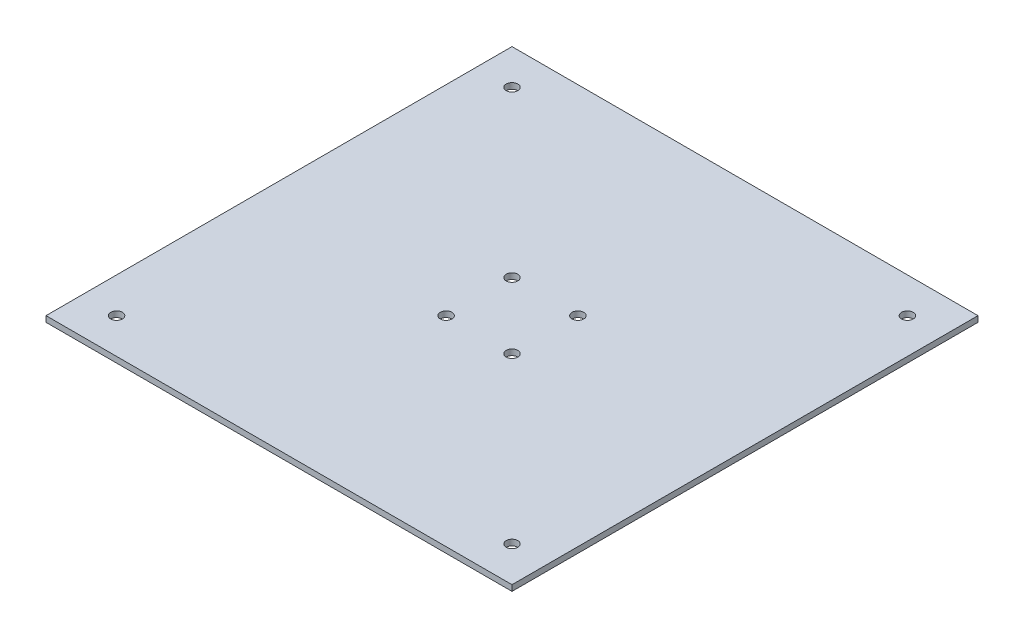
ISO-10303-21;
HEADER;
FILE_DESCRIPTION(('STEP AP214'),'2;1');
FILE_NAME('part.step','',(''),(''),'','','');
FILE_SCHEMA(('AUTOMOTIVE_DESIGN { 1 0 10303 214 1 1 1 1 }'));
ENDSEC;
DATA;
#1=APPLICATION_CONTEXT('core data for automotive mechanical design processes');
#2=APPLICATION_PROTOCOL_DEFINITION('international standard','automotive_design',2000,#1);
#3=PRODUCT_CONTEXT('',#1,'mechanical');
#4=PRODUCT('Part','Part','',(#3));
#5=PRODUCT_RELATED_PRODUCT_CATEGORY('part','',(#4));
#6=PRODUCT_DEFINITION_FORMATION('','',#4);
#7=PRODUCT_DEFINITION_CONTEXT('part definition',#1,'design');
#8=PRODUCT_DEFINITION('design','',#6,#7);
#9=PRODUCT_DEFINITION_SHAPE('','',#8);
#10=(LENGTH_UNIT() NAMED_UNIT(*) SI_UNIT(.MILLI.,.METRE.));
#11=(NAMED_UNIT(*) PLANE_ANGLE_UNIT() SI_UNIT($,.RADIAN.));
#12=(NAMED_UNIT(*) SI_UNIT($,.STERADIAN.) SOLID_ANGLE_UNIT());
#13=UNCERTAINTY_MEASURE_WITH_UNIT(LENGTH_MEASURE(1.E-05),#10,'distance_accuracy_value','');
#14=(GEOMETRIC_REPRESENTATION_CONTEXT(3) GLOBAL_UNCERTAINTY_ASSIGNED_CONTEXT((#13)) GLOBAL_UNIT_ASSIGNED_CONTEXT((#10,
#11,#12)) REPRESENTATION_CONTEXT('',''));
#15=CARTESIAN_POINT('',(0.,0.,0.));
#16=DIRECTION('',(0.,0.,1.));
#17=DIRECTION('',(1.,0.,0.));
#18=AXIS2_PLACEMENT_3D('',#15,#16,#17);
#19=CARTESIAN_POINT('',(0.,1.5875,0.));
#20=DIRECTION('',(1.,0.,0.));
#21=DIRECTION('',(0.,0.,-1.));
#22=AXIS2_PLACEMENT_3D('',#19,#20,#21);
#23=PLANE('',#22);
#24=DIRECTION('',(0.,0.,1.));
#25=VECTOR('',#24,1.);
#26=CARTESIAN_POINT('',(0.,0.,0.));
#27=LINE('',#26,#25);
#28=CARTESIAN_POINT('',(0.,0.,-127.));
#29=VERTEX_POINT('',#28);
#30=CARTESIAN_POINT('',(0.,0.,0.));
#31=VERTEX_POINT('',#30);
#32=EDGE_CURVE('E98',#29,#31,#27,.T.);
#33=ORIENTED_EDGE('',*,*,#32,.T.);
#34=DIRECTION('',(0.,-1.,0.));
#35=VECTOR('',#34,1.);
#36=CARTESIAN_POINT('',(0.,1.5875,0.));
#37=LINE('',#36,#35);
#38=CARTESIAN_POINT('',(0.,1.5875,0.));
#39=VERTEX_POINT('',#38);
#40=EDGE_CURVE('E11',#39,#31,#37,.T.);
#41=ORIENTED_EDGE('',*,*,#40,.F.);
#42=DIRECTION('',(0.,0.,1.));
#43=VECTOR('',#42,1.);
#44=CARTESIAN_POINT('',(0.,1.5875,0.));
#45=LINE('',#44,#43);
#46=CARTESIAN_POINT('',(0.,1.5875,-127.));
#47=VERTEX_POINT('',#46);
#48=EDGE_CURVE('E86',#47,#39,#45,.T.);
#49=ORIENTED_EDGE('',*,*,#48,.F.);
#50=DIRECTION('',(0.,-1.,0.));
#51=VECTOR('',#50,1.);
#52=CARTESIAN_POINT('',(0.,1.5875,-127.));
#53=LINE('',#52,#51);
#54=EDGE_CURVE('E94',#47,#29,#53,.T.);
#55=ORIENTED_EDGE('',*,*,#54,.T.);
#56=EDGE_LOOP('',(#33,#41,#49,#55));
#57=FACE_BOUND('',#56,.T.);
#58=ADVANCED_FACE('F35',(#57),#23,.F.);
#59=CARTESIAN_POINT('',(0.,1.5875,0.));
#60=DIRECTION('',(0.,0.,-1.));
#61=DIRECTION('',(-1.,0.,0.));
#62=AXIS2_PLACEMENT_3D('',#59,#60,#61);
#63=PLANE('',#62);
#64=DIRECTION('',(1.,0.,0.));
#65=VECTOR('',#64,1.);
#66=CARTESIAN_POINT('',(0.,0.,0.));
#67=LINE('',#66,#65);
#68=CARTESIAN_POINT('',(127.,0.,0.));
#69=VERTEX_POINT('',#68);
#70=EDGE_CURVE('E90',#31,#69,#67,.T.);
#71=ORIENTED_EDGE('',*,*,#70,.T.);
#72=DIRECTION('',(0.,-1.,0.));
#73=VECTOR('',#72,1.);
#74=CARTESIAN_POINT('',(127.,1.5875,0.));
#75=LINE('',#74,#73);
#76=CARTESIAN_POINT('',(127.,1.5875,0.));
#77=VERTEX_POINT('',#76);
#78=EDGE_CURVE('E43',#77,#69,#75,.T.);
#79=ORIENTED_EDGE('',*,*,#78,.F.);
#80=DIRECTION('',(1.,0.,0.));
#81=VECTOR('',#80,1.);
#82=CARTESIAN_POINT('',(0.,1.5875,0.));
#83=LINE('',#82,#81);
#84=EDGE_CURVE('E81',#39,#77,#83,.T.);
#85=ORIENTED_EDGE('',*,*,#84,.F.);
#86=ORIENTED_EDGE('',*,*,#40,.T.);
#87=EDGE_LOOP('',(#71,#79,#85,#86));
#88=FACE_BOUND('',#87,.T.);
#89=ADVANCED_FACE('F89',(#88),#63,.F.);
#90=CARTESIAN_POINT('',(127.,1.5875,0.));
#91=DIRECTION('',(-1.,0.,0.));
#92=DIRECTION('',(0.,0.,1.));
#93=AXIS2_PLACEMENT_3D('',#90,#91,#92);
#94=PLANE('',#93);
#95=DIRECTION('',(0.,0.,-1.));
#96=VECTOR('',#95,1.);
#97=CARTESIAN_POINT('',(127.,0.,0.));
#98=LINE('',#97,#96);
#99=CARTESIAN_POINT('',(127.,0.,-127.));
#100=VERTEX_POINT('',#99);
#101=EDGE_CURVE('E68',#69,#100,#98,.T.);
#102=ORIENTED_EDGE('',*,*,#101,.T.);
#103=DIRECTION('',(0.,-1.,0.));
#104=VECTOR('',#103,1.);
#105=CARTESIAN_POINT('',(127.,1.5875,-127.));
#106=LINE('',#105,#104);
#107=CARTESIAN_POINT('',(127.,1.5875,-127.));
#108=VERTEX_POINT('',#107);
#109=EDGE_CURVE('E91',#108,#100,#106,.T.);
#110=ORIENTED_EDGE('',*,*,#109,.F.);
#111=DIRECTION('',(0.,0.,-1.));
#112=VECTOR('',#111,1.);
#113=CARTESIAN_POINT('',(127.,1.5875,0.));
#114=LINE('',#113,#112);
#115=EDGE_CURVE('E84',#77,#108,#114,.T.);
#116=ORIENTED_EDGE('',*,*,#115,.F.);
#117=ORIENTED_EDGE('',*,*,#78,.T.);
#118=EDGE_LOOP('',(#102,#110,#116,#117));
#119=FACE_BOUND('',#118,.T.);
#120=ADVANCED_FACE('F92',(#119),#94,.F.);
#121=CARTESIAN_POINT('',(0.,1.5875,-127.));
#122=DIRECTION('',(0.,0.,1.));
#123=DIRECTION('',(1.,0.,0.));
#124=AXIS2_PLACEMENT_3D('',#121,#122,#123);
#125=PLANE('',#124);
#126=DIRECTION('',(-1.,0.,0.));
#127=VECTOR('',#126,1.);
#128=CARTESIAN_POINT('',(0.,0.,-127.));
#129=LINE('',#128,#127);
#130=EDGE_CURVE('E74',#100,#29,#129,.T.);
#131=ORIENTED_EDGE('',*,*,#130,.T.);
#132=ORIENTED_EDGE('',*,*,#54,.F.);
#133=DIRECTION('',(-1.,0.,0.));
#134=VECTOR('',#133,1.);
#135=CARTESIAN_POINT('',(0.,1.5875,-127.));
#136=LINE('',#135,#134);
#137=EDGE_CURVE('E51',#108,#47,#136,.T.);
#138=ORIENTED_EDGE('',*,*,#137,.F.);
#139=ORIENTED_EDGE('',*,*,#109,.T.);
#140=EDGE_LOOP('',(#131,#132,#138,#139));
#141=FACE_BOUND('',#140,.T.);
#142=ADVANCED_FACE('F106',(#141),#125,.F.);
#143=CARTESIAN_POINT('',(0.,1.5875,-127.));
#144=DIRECTION('',(0.,-1.,0.));
#145=DIRECTION('',(0.,0.,-1.));
#146=AXIS2_PLACEMENT_3D('',#143,#144,#145);
#147=PLANE('',#146);
#148=CARTESIAN_POINT('',(117.381536726415,1.5875,-117.381536726415));
#149=DIRECTION('',(0.,1.,0.));
#150=DIRECTION('',(1.,0.,0.));
#151=AXIS2_PLACEMENT_3D('',#148,#149,#150);
#152=CIRCLE('',#151,1.5875);
#153=CARTESIAN_POINT('',(118.969036726415,1.5875,-117.381536726415));
#154=VERTEX_POINT('',#153);
#155=EDGE_CURVE('E153',#154,#154,#152,.T.);
#156=ORIENTED_EDGE('',*,*,#155,.F.);
#157=EDGE_LOOP('',(#156));
#158=FACE_BOUND('',#157,.T.);
#159=CARTESIAN_POINT('',(9.61846327358507,1.5875,-117.381536726415));
#160=DIRECTION('',(0.,1.,0.));
#161=DIRECTION('',(1.,0.,0.));
#162=AXIS2_PLACEMENT_3D('',#159,#160,#161);
#163=CIRCLE('',#162,1.5875);
#164=CARTESIAN_POINT('',(11.2059632735851,1.5875,-117.381536726415));
#165=VERTEX_POINT('',#164);
#166=EDGE_CURVE('E147',#165,#165,#163,.T.);
#167=ORIENTED_EDGE('',*,*,#166,.F.);
#168=EDGE_LOOP('',(#167));
#169=FACE_BOUND('',#168,.T.);
#170=CARTESIAN_POINT('',(54.5197438789308,1.5875,-72.4802561210691));
#171=DIRECTION('',(0.,1.,0.));
#172=DIRECTION('',(1.,0.,0.));
#173=AXIS2_PLACEMENT_3D('',#170,#171,#172);
#174=CIRCLE('',#173,1.58750000000001);
#175=CARTESIAN_POINT('',(56.1072438789308,1.5875,-72.4802561210691));
#176=VERTEX_POINT('',#175);
#177=EDGE_CURVE('E141',#176,#176,#174,.T.);
#178=ORIENTED_EDGE('',*,*,#177,.F.);
#179=EDGE_LOOP('',(#178));
#180=FACE_BOUND('',#179,.T.);
#181=CARTESIAN_POINT('',(72.4802561210691,1.5875,-72.4802561210692));
#182=DIRECTION('',(0.,1.,0.));
#183=DIRECTION('',(1.,0.,0.));
#184=AXIS2_PLACEMENT_3D('',#181,#182,#183);
#185=CIRCLE('',#184,1.5875);
#186=CARTESIAN_POINT('',(74.0677561210691,1.5875,-72.4802561210692));
#187=VERTEX_POINT('',#186);
#188=EDGE_CURVE('E135',#187,#187,#185,.T.);
#189=ORIENTED_EDGE('',*,*,#188,.F.);
#190=EDGE_LOOP('',(#189));
#191=FACE_BOUND('',#190,.T.);
#192=CARTESIAN_POINT('',(117.381536726415,1.5875,-9.61846327358508));
#193=DIRECTION('',(0.,1.,0.));
#194=DIRECTION('',(1.,0.,0.));
#195=AXIS2_PLACEMENT_3D('',#192,#193,#194);
#196=CIRCLE('',#195,1.5875);
#197=CARTESIAN_POINT('',(118.969036726415,1.5875,-9.61846327358508));
#198=VERTEX_POINT('',#197);
#199=EDGE_CURVE('E129',#198,#198,#196,.T.);
#200=ORIENTED_EDGE('',*,*,#199,.F.);
#201=EDGE_LOOP('',(#200));
#202=FACE_BOUND('',#201,.T.);
#203=CARTESIAN_POINT('',(72.4802561210692,1.5875,-54.5197438789308));
#204=DIRECTION('',(0.,1.,0.));
#205=DIRECTION('',(1.,0.,0.));
#206=AXIS2_PLACEMENT_3D('',#203,#204,#205);
#207=CIRCLE('',#206,1.5875);
#208=CARTESIAN_POINT('',(74.0677561210692,1.5875,-54.5197438789308));
#209=VERTEX_POINT('',#208);
#210=EDGE_CURVE('E123',#209,#209,#207,.T.);
#211=ORIENTED_EDGE('',*,*,#210,.F.);
#212=EDGE_LOOP('',(#211));
#213=FACE_BOUND('',#212,.T.);
#214=CARTESIAN_POINT('',(9.61846327358509,1.5875,-9.61846327358509));
#215=DIRECTION('',(0.,1.,0.));
#216=DIRECTION('',(1.,0.,0.));
#217=AXIS2_PLACEMENT_3D('',#214,#215,#216);
#218=CIRCLE('',#217,1.5875);
#219=CARTESIAN_POINT('',(11.2059632735851,1.5875,-9.61846327358509));
#220=VERTEX_POINT('',#219);
#221=EDGE_CURVE('E117',#220,#220,#218,.T.);
#222=ORIENTED_EDGE('',*,*,#221,.F.);
#223=EDGE_LOOP('',(#222));
#224=FACE_BOUND('',#223,.T.);
#225=CARTESIAN_POINT('',(54.5197438789309,1.5875,-54.5197438789308));
#226=DIRECTION('',(0.,1.,0.));
#227=DIRECTION('',(1.,0.,0.));
#228=AXIS2_PLACEMENT_3D('',#225,#226,#227);
#229=CIRCLE('',#228,1.5875);
#230=CARTESIAN_POINT('',(56.1072438789309,1.5875,-54.5197438789308));
#231=VERTEX_POINT('',#230);
#232=EDGE_CURVE('E114',#231,#231,#229,.T.);
#233=ORIENTED_EDGE('',*,*,#232,.F.);
#234=EDGE_LOOP('',(#233));
#235=FACE_BOUND('',#234,.T.);
#236=ORIENTED_EDGE('',*,*,#48,.T.);
#237=ORIENTED_EDGE('',*,*,#84,.T.);
#238=ORIENTED_EDGE('',*,*,#115,.T.);
#239=ORIENTED_EDGE('',*,*,#137,.T.);
#240=EDGE_LOOP('',(#236,#237,#238,#239));
#241=FACE_BOUND('',#240,.T.);
#242=ADVANCED_FACE('F82',(#158,#169,#180,#191,#202,#213,#224,#235,#241),#147,.F.);
#243=CARTESIAN_POINT('',(0.,0.,-127.));
#244=DIRECTION('',(0.,-1.,0.));
#245=DIRECTION('',(0.,0.,-1.));
#246=AXIS2_PLACEMENT_3D('',#243,#244,#245);
#247=PLANE('',#246);
#248=CARTESIAN_POINT('',(117.381536726415,0.,-117.381536726415));
#249=DIRECTION('',(0.,-1.,0.));
#250=DIRECTION('',(0.,0.,-1.));
#251=AXIS2_PLACEMENT_3D('',#248,#249,#250);
#252=CIRCLE('',#251,1.5875);
#253=CARTESIAN_POINT('',(117.381536726415,0.,-118.969036726415));
#254=VERTEX_POINT('',#253);
#255=EDGE_CURVE('E156',#254,#254,#252,.F.);
#256=ORIENTED_EDGE('',*,*,#255,.T.);
#257=EDGE_LOOP('',(#256));
#258=FACE_BOUND('',#257,.T.);
#259=CARTESIAN_POINT('',(9.61846327358507,0.,-117.381536726415));
#260=DIRECTION('',(0.,-1.,0.));
#261=DIRECTION('',(0.,0.,-1.));
#262=AXIS2_PLACEMENT_3D('',#259,#260,#261);
#263=CIRCLE('',#262,1.5875);
#264=CARTESIAN_POINT('',(9.61846327358507,0.,-118.969036726415));
#265=VERTEX_POINT('',#264);
#266=EDGE_CURVE('E150',#265,#265,#263,.F.);
#267=ORIENTED_EDGE('',*,*,#266,.T.);
#268=EDGE_LOOP('',(#267));
#269=FACE_BOUND('',#268,.T.);
#270=CARTESIAN_POINT('',(54.5197438789308,0.,-72.4802561210691));
#271=DIRECTION('',(0.,-1.,0.));
#272=DIRECTION('',(0.,0.,-1.));
#273=AXIS2_PLACEMENT_3D('',#270,#271,#272);
#274=CIRCLE('',#273,1.58750000000001);
#275=CARTESIAN_POINT('',(54.5197438789308,0.,-74.0677561210692));
#276=VERTEX_POINT('',#275);
#277=EDGE_CURVE('E144',#276,#276,#274,.F.);
#278=ORIENTED_EDGE('',*,*,#277,.T.);
#279=EDGE_LOOP('',(#278));
#280=FACE_BOUND('',#279,.T.);
#281=CARTESIAN_POINT('',(72.4802561210691,0.,-72.4802561210692));
#282=DIRECTION('',(0.,-1.,0.));
#283=DIRECTION('',(0.,0.,-1.));
#284=AXIS2_PLACEMENT_3D('',#281,#282,#283);
#285=CIRCLE('',#284,1.5875);
#286=CARTESIAN_POINT('',(72.4802561210691,0.,-74.0677561210692));
#287=VERTEX_POINT('',#286);
#288=EDGE_CURVE('E138',#287,#287,#285,.F.);
#289=ORIENTED_EDGE('',*,*,#288,.T.);
#290=EDGE_LOOP('',(#289));
#291=FACE_BOUND('',#290,.T.);
#292=CARTESIAN_POINT('',(117.381536726415,0.,-9.61846327358508));
#293=DIRECTION('',(0.,-1.,0.));
#294=DIRECTION('',(0.,0.,-1.));
#295=AXIS2_PLACEMENT_3D('',#292,#293,#294);
#296=CIRCLE('',#295,1.5875);
#297=CARTESIAN_POINT('',(117.381536726415,0.,-11.2059632735851));
#298=VERTEX_POINT('',#297);
#299=EDGE_CURVE('E132',#298,#298,#296,.F.);
#300=ORIENTED_EDGE('',*,*,#299,.T.);
#301=EDGE_LOOP('',(#300));
#302=FACE_BOUND('',#301,.T.);
#303=CARTESIAN_POINT('',(72.4802561210692,0.,-54.5197438789308));
#304=DIRECTION('',(0.,-1.,0.));
#305=DIRECTION('',(0.,0.,-1.));
#306=AXIS2_PLACEMENT_3D('',#303,#304,#305);
#307=CIRCLE('',#306,1.5875);
#308=CARTESIAN_POINT('',(72.4802561210692,0.,-56.1072438789308));
#309=VERTEX_POINT('',#308);
#310=EDGE_CURVE('E126',#309,#309,#307,.F.);
#311=ORIENTED_EDGE('',*,*,#310,.T.);
#312=EDGE_LOOP('',(#311));
#313=FACE_BOUND('',#312,.T.);
#314=CARTESIAN_POINT('',(9.61846327358509,0.,-9.61846327358509));
#315=DIRECTION('',(0.,-1.,0.));
#316=DIRECTION('',(0.,0.,-1.));
#317=AXIS2_PLACEMENT_3D('',#314,#315,#316);
#318=CIRCLE('',#317,1.5875);
#319=CARTESIAN_POINT('',(9.61846327358509,0.,-11.2059632735851));
#320=VERTEX_POINT('',#319);
#321=EDGE_CURVE('E120',#320,#320,#318,.F.);
#322=ORIENTED_EDGE('',*,*,#321,.T.);
#323=EDGE_LOOP('',(#322));
#324=FACE_BOUND('',#323,.T.);
#325=CARTESIAN_POINT('',(54.5197438789309,0.,-54.5197438789308));
#326=DIRECTION('',(0.,-1.,0.));
#327=DIRECTION('',(0.,0.,-1.));
#328=AXIS2_PLACEMENT_3D('',#325,#326,#327);
#329=CIRCLE('',#328,1.5875);
#330=CARTESIAN_POINT('',(54.5197438789309,0.,-56.1072438789308));
#331=VERTEX_POINT('',#330);
#332=EDGE_CURVE('E101',#331,#331,#329,.F.);
#333=ORIENTED_EDGE('',*,*,#332,.T.);
#334=EDGE_LOOP('',(#333));
#335=FACE_BOUND('',#334,.T.);
#336=ORIENTED_EDGE('',*,*,#32,.F.);
#337=ORIENTED_EDGE('',*,*,#130,.F.);
#338=ORIENTED_EDGE('',*,*,#101,.F.);
#339=ORIENTED_EDGE('',*,*,#70,.F.);
#340=EDGE_LOOP('',(#336,#337,#338,#339));
#341=FACE_BOUND('',#340,.T.);
#342=ADVANCED_FACE('F109',(#258,#269,#280,#291,#302,#313,#324,#335,#341),#247,.T.);
#343=CARTESIAN_POINT('',(54.5197438789309,-4.4901280605346,-54.5197438789308));
#344=DIRECTION('',(0.,1.,0.));
#345=DIRECTION('',(0.,0.,1.));
#346=AXIS2_PLACEMENT_3D('',#343,#344,#345);
#347=CYLINDRICAL_SURFACE('',#346,1.5875);
#348=ORIENTED_EDGE('',*,*,#232,.T.);
#349=EDGE_LOOP('',(#348));
#350=FACE_BOUND('',#349,.T.);
#351=ORIENTED_EDGE('',*,*,#332,.F.);
#352=EDGE_LOOP('',(#351));
#353=FACE_BOUND('',#352,.T.);
#354=ADVANCED_FACE('F186',(#350,#353),#347,.F.);
#355=CARTESIAN_POINT('',(9.61846327358509,-4.4901280605346,-9.61846327358509));
#356=DIRECTION('',(0.,1.,0.));
#357=DIRECTION('',(0.,0.,1.));
#358=AXIS2_PLACEMENT_3D('',#355,#356,#357);
#359=CYLINDRICAL_SURFACE('',#358,1.5875);
#360=ORIENTED_EDGE('',*,*,#221,.T.);
#361=EDGE_LOOP('',(#360));
#362=FACE_BOUND('',#361,.T.);
#363=ORIENTED_EDGE('',*,*,#321,.F.);
#364=EDGE_LOOP('',(#363));
#365=FACE_BOUND('',#364,.T.);
#366=ADVANCED_FACE('F192',(#362,#365),#359,.F.);
#367=CARTESIAN_POINT('',(72.4802561210692,-4.4901280605346,-54.5197438789308));
#368=DIRECTION('',(0.,1.,0.));
#369=DIRECTION('',(0.,0.,1.));
#370=AXIS2_PLACEMENT_3D('',#367,#368,#369);
#371=CYLINDRICAL_SURFACE('',#370,1.5875);
#372=ORIENTED_EDGE('',*,*,#210,.T.);
#373=EDGE_LOOP('',(#372));
#374=FACE_BOUND('',#373,.T.);
#375=ORIENTED_EDGE('',*,*,#310,.F.);
#376=EDGE_LOOP('',(#375));
#377=FACE_BOUND('',#376,.T.);
#378=ADVANCED_FACE('F196',(#374,#377),#371,.F.);
#379=CARTESIAN_POINT('',(117.381536726415,-4.4901280605346,-9.61846327358508));
#380=DIRECTION('',(0.,1.,0.));
#381=DIRECTION('',(0.,0.,1.));
#382=AXIS2_PLACEMENT_3D('',#379,#380,#381);
#383=CYLINDRICAL_SURFACE('',#382,1.5875);
#384=ORIENTED_EDGE('',*,*,#199,.T.);
#385=EDGE_LOOP('',(#384));
#386=FACE_BOUND('',#385,.T.);
#387=ORIENTED_EDGE('',*,*,#299,.F.);
#388=EDGE_LOOP('',(#387));
#389=FACE_BOUND('',#388,.T.);
#390=ADVANCED_FACE('F200',(#386,#389),#383,.F.);
#391=CARTESIAN_POINT('',(72.4802561210691,-4.4901280605346,-72.4802561210692));
#392=DIRECTION('',(0.,1.,0.));
#393=DIRECTION('',(0.,0.,1.));
#394=AXIS2_PLACEMENT_3D('',#391,#392,#393);
#395=CYLINDRICAL_SURFACE('',#394,1.5875);
#396=ORIENTED_EDGE('',*,*,#188,.T.);
#397=EDGE_LOOP('',(#396));
#398=FACE_BOUND('',#397,.T.);
#399=ORIENTED_EDGE('',*,*,#288,.F.);
#400=EDGE_LOOP('',(#399));
#401=FACE_BOUND('',#400,.T.);
#402=ADVANCED_FACE('F204',(#398,#401),#395,.F.);
#403=CARTESIAN_POINT('',(54.5197438789308,-4.4901280605346,-72.4802561210691));
#404=DIRECTION('',(0.,1.,0.));
#405=DIRECTION('',(0.,0.,1.));
#406=AXIS2_PLACEMENT_3D('',#403,#404,#405);
#407=CYLINDRICAL_SURFACE('',#406,1.58750000000001);
#408=ORIENTED_EDGE('',*,*,#177,.T.);
#409=EDGE_LOOP('',(#408));
#410=FACE_BOUND('',#409,.T.);
#411=ORIENTED_EDGE('',*,*,#277,.F.);
#412=EDGE_LOOP('',(#411));
#413=FACE_BOUND('',#412,.T.);
#414=ADVANCED_FACE('F170',(#410,#413),#407,.F.);
#415=CARTESIAN_POINT('',(9.61846327358507,-4.4901280605346,-117.381536726415));
#416=DIRECTION('',(0.,1.,0.));
#417=DIRECTION('',(0.,0.,1.));
#418=AXIS2_PLACEMENT_3D('',#415,#416,#417);
#419=CYLINDRICAL_SURFACE('',#418,1.5875);
#420=ORIENTED_EDGE('',*,*,#166,.T.);
#421=EDGE_LOOP('',(#420));
#422=FACE_BOUND('',#421,.T.);
#423=ORIENTED_EDGE('',*,*,#266,.F.);
#424=EDGE_LOOP('',(#423));
#425=FACE_BOUND('',#424,.T.);
#426=ADVANCED_FACE('F164',(#422,#425),#419,.F.);
#427=CARTESIAN_POINT('',(117.381536726415,-4.4901280605346,-117.381536726415));
#428=DIRECTION('',(0.,1.,0.));
#429=DIRECTION('',(0.,0.,1.));
#430=AXIS2_PLACEMENT_3D('',#427,#428,#429);
#431=CYLINDRICAL_SURFACE('',#430,1.5875);
#432=ORIENTED_EDGE('',*,*,#155,.T.);
#433=EDGE_LOOP('',(#432));
#434=FACE_BOUND('',#433,.T.);
#435=ORIENTED_EDGE('',*,*,#255,.F.);
#436=EDGE_LOOP('',(#435));
#437=FACE_BOUND('',#436,.T.);
#438=ADVANCED_FACE('F162',(#434,#437),#431,.F.);
#439=CLOSED_SHELL('',(#58,#89,#120,#142,#242,#342,#354,#366,#378,#390,#402,#414,#426,#438));
#440=MANIFOLD_SOLID_BREP('B2',#439);
#441=ADVANCED_BREP_SHAPE_REPRESENTATION('',(#18,#440),#14);
#442=SHAPE_DEFINITION_REPRESENTATION(#9,#441);
ENDSEC;
END-ISO-10303-21;
